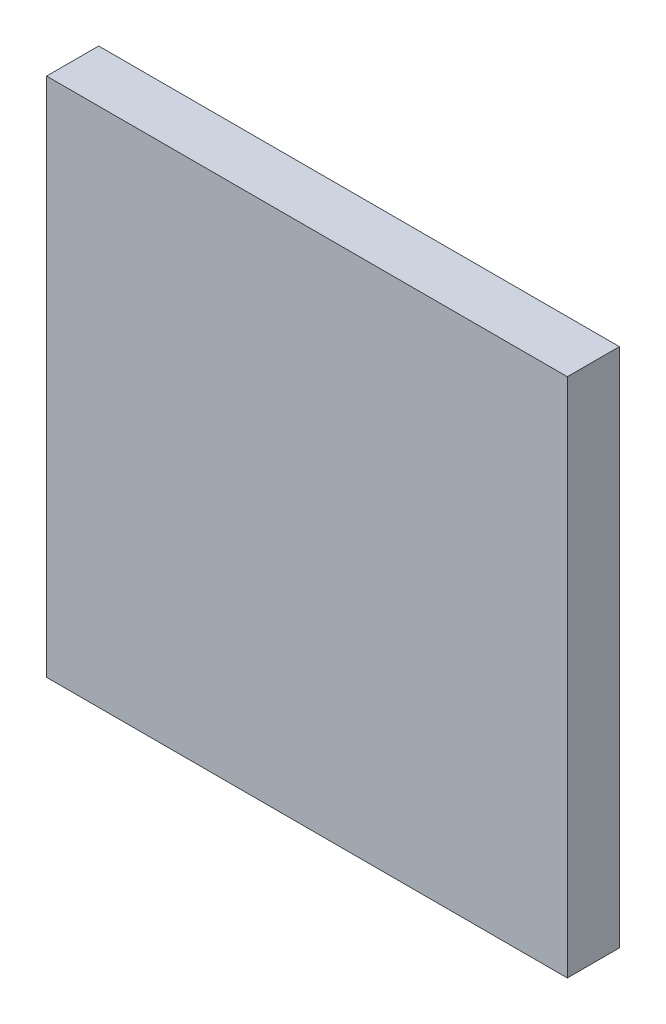
ISO-10303-21;
HEADER;
FILE_DESCRIPTION(('STEP AP214'),'2;1');
FILE_NAME('part.step','',(''),(''),'','','');
FILE_SCHEMA(('AUTOMOTIVE_DESIGN { 1 0 10303 214 1 1 1 1 }'));
ENDSEC;
DATA;
#1=APPLICATION_CONTEXT('core data for automotive mechanical design processes');
#2=APPLICATION_PROTOCOL_DEFINITION('international standard','automotive_design',2000,#1);
#3=PRODUCT_CONTEXT('',#1,'mechanical');
#4=PRODUCT('Part','Part','',(#3));
#5=PRODUCT_RELATED_PRODUCT_CATEGORY('part','',(#4));
#6=PRODUCT_DEFINITION_FORMATION('','',#4);
#7=PRODUCT_DEFINITION_CONTEXT('part definition',#1,'design');
#8=PRODUCT_DEFINITION('design','',#6,#7);
#9=PRODUCT_DEFINITION_SHAPE('','',#8);
#10=(LENGTH_UNIT() NAMED_UNIT(*) SI_UNIT(.MILLI.,.METRE.));
#11=(NAMED_UNIT(*) PLANE_ANGLE_UNIT() SI_UNIT($,.RADIAN.));
#12=(NAMED_UNIT(*) SI_UNIT($,.STERADIAN.) SOLID_ANGLE_UNIT());
#13=UNCERTAINTY_MEASURE_WITH_UNIT(LENGTH_MEASURE(1.E-05),#10,'distance_accuracy_value','');
#14=(GEOMETRIC_REPRESENTATION_CONTEXT(3) GLOBAL_UNCERTAINTY_ASSIGNED_CONTEXT((#13)) GLOBAL_UNIT_ASSIGNED_CONTEXT((#10,
#11,#12)) REPRESENTATION_CONTEXT('',''));
#15=CARTESIAN_POINT('',(0.,0.,0.));
#16=DIRECTION('',(0.,0.,1.));
#17=DIRECTION('',(1.,0.,0.));
#18=AXIS2_PLACEMENT_3D('',#15,#16,#17);
#19=CARTESIAN_POINT('',(0.,0.,30.));
#20=DIRECTION('',(1.,0.,0.));
#21=DIRECTION('',(0.,0.,-1.));
#22=AXIS2_PLACEMENT_3D('',#19,#20,#21);
#23=PLANE('',#22);
#24=DIRECTION('',(0.,-1.,0.));
#25=VECTOR('',#24,1.);
#26=CARTESIAN_POINT('',(0.,0.,0.));
#27=LINE('',#26,#25);
#28=CARTESIAN_POINT('',(0.,300.,0.));
#29=VERTEX_POINT('',#28);
#30=CARTESIAN_POINT('',(0.,0.,0.));
#31=VERTEX_POINT('',#30);
#32=EDGE_CURVE('E107',#29,#31,#27,.T.);
#33=ORIENTED_EDGE('',*,*,#32,.T.);
#34=DIRECTION('',(0.,0.,-1.));
#35=VECTOR('',#34,1.);
#36=CARTESIAN_POINT('',(0.,0.,30.));
#37=LINE('',#36,#35);
#38=CARTESIAN_POINT('',(0.,0.,30.));
#39=VERTEX_POINT('',#38);
#40=EDGE_CURVE('E11',#39,#31,#37,.T.);
#41=ORIENTED_EDGE('',*,*,#40,.F.);
#42=DIRECTION('',(0.,-1.,0.));
#43=VECTOR('',#42,1.);
#44=CARTESIAN_POINT('',(0.,0.,30.));
#45=LINE('',#44,#43);
#46=CARTESIAN_POINT('',(0.,300.,30.));
#47=VERTEX_POINT('',#46);
#48=EDGE_CURVE('E91',#47,#39,#45,.T.);
#49=ORIENTED_EDGE('',*,*,#48,.F.);
#50=DIRECTION('',(0.,0.,-1.));
#51=VECTOR('',#50,1.);
#52=CARTESIAN_POINT('',(0.,300.,30.));
#53=LINE('',#52,#51);
#54=EDGE_CURVE('E103',#47,#29,#53,.T.);
#55=ORIENTED_EDGE('',*,*,#54,.T.);
#56=EDGE_LOOP('',(#33,#41,#49,#55));
#57=FACE_BOUND('',#56,.T.);
#58=ADVANCED_FACE('F39',(#57),#23,.F.);
#59=CARTESIAN_POINT('',(0.,0.,30.));
#60=DIRECTION('',(0.,1.,0.));
#61=DIRECTION('',(0.,0.,1.));
#62=AXIS2_PLACEMENT_3D('',#59,#60,#61);
#63=PLANE('',#62);
#64=DIRECTION('',(1.,0.,0.));
#65=VECTOR('',#64,1.);
#66=CARTESIAN_POINT('',(0.,0.,0.));
#67=LINE('',#66,#65);
#68=CARTESIAN_POINT('',(300.,0.,0.));
#69=VERTEX_POINT('',#68);
#70=EDGE_CURVE('E96',#31,#69,#67,.T.);
#71=ORIENTED_EDGE('',*,*,#70,.T.);
#72=DIRECTION('',(0.,0.,-1.));
#73=VECTOR('',#72,1.);
#74=CARTESIAN_POINT('',(300.,0.,30.));
#75=LINE('',#74,#73);
#76=CARTESIAN_POINT('',(300.,0.,30.));
#77=VERTEX_POINT('',#76);
#78=EDGE_CURVE('E48',#77,#69,#75,.T.);
#79=ORIENTED_EDGE('',*,*,#78,.F.);
#80=DIRECTION('',(1.,0.,0.));
#81=VECTOR('',#80,1.);
#82=CARTESIAN_POINT('',(0.,0.,30.));
#83=LINE('',#82,#81);
#84=EDGE_CURVE('E86',#39,#77,#83,.T.);
#85=ORIENTED_EDGE('',*,*,#84,.F.);
#86=ORIENTED_EDGE('',*,*,#40,.T.);
#87=EDGE_LOOP('',(#71,#79,#85,#86));
#88=FACE_BOUND('',#87,.T.);
#89=ADVANCED_FACE('F95',(#88),#63,.F.);
#90=CARTESIAN_POINT('',(300.,0.,30.));
#91=DIRECTION('',(-1.,0.,0.));
#92=DIRECTION('',(0.,-1.,0.));
#93=AXIS2_PLACEMENT_3D('',#90,#91,#92);
#94=PLANE('',#93);
#95=DIRECTION('',(0.,1.,0.));
#96=VECTOR('',#95,1.);
#97=CARTESIAN_POINT('',(300.,0.,0.));
#98=LINE('',#97,#96);
#99=CARTESIAN_POINT('',(300.,300.,0.));
#100=VERTEX_POINT('',#99);
#101=EDGE_CURVE('E73',#69,#100,#98,.T.);
#102=ORIENTED_EDGE('',*,*,#101,.T.);
#103=DIRECTION('',(0.,0.,-1.));
#104=VECTOR('',#103,1.);
#105=CARTESIAN_POINT('',(300.,300.,30.));
#106=LINE('',#105,#104);
#107=CARTESIAN_POINT('',(300.,300.,30.));
#108=VERTEX_POINT('',#107);
#109=EDGE_CURVE('E98',#108,#100,#106,.T.);
#110=ORIENTED_EDGE('',*,*,#109,.F.);
#111=DIRECTION('',(0.,1.,0.));
#112=VECTOR('',#111,1.);
#113=CARTESIAN_POINT('',(300.,0.,30.));
#114=LINE('',#113,#112);
#115=EDGE_CURVE('E89',#77,#108,#114,.T.);
#116=ORIENTED_EDGE('',*,*,#115,.F.);
#117=ORIENTED_EDGE('',*,*,#78,.T.);
#118=EDGE_LOOP('',(#102,#110,#116,#117));
#119=FACE_BOUND('',#118,.T.);
#120=ADVANCED_FACE('F99',(#119),#94,.F.);
#121=CARTESIAN_POINT('',(0.,300.,30.));
#122=DIRECTION('',(0.,-1.,0.));
#123=DIRECTION('',(1.,0.,0.));
#124=AXIS2_PLACEMENT_3D('',#121,#122,#123);
#125=PLANE('',#124);
#126=DIRECTION('',(-1.,0.,0.));
#127=VECTOR('',#126,1.);
#128=CARTESIAN_POINT('',(0.,300.,0.));
#129=LINE('',#128,#127);
#130=EDGE_CURVE('E79',#100,#29,#129,.T.);
#131=ORIENTED_EDGE('',*,*,#130,.T.);
#132=ORIENTED_EDGE('',*,*,#54,.F.);
#133=DIRECTION('',(-1.,0.,0.));
#134=VECTOR('',#133,1.);
#135=CARTESIAN_POINT('',(0.,300.,30.));
#136=LINE('',#135,#134);
#137=EDGE_CURVE('E56',#108,#47,#136,.T.);
#138=ORIENTED_EDGE('',*,*,#137,.F.);
#139=ORIENTED_EDGE('',*,*,#109,.T.);
#140=EDGE_LOOP('',(#131,#132,#138,#139));
#141=FACE_BOUND('',#140,.T.);
#142=ADVANCED_FACE('F120',(#141),#125,.F.);
#143=CARTESIAN_POINT('',(0.,0.,30.));
#144=DIRECTION('',(0.,0.,-1.));
#145=DIRECTION('',(-1.,0.,0.));
#146=AXIS2_PLACEMENT_3D('',#143,#144,#145);
#147=PLANE('',#146);
#148=ORIENTED_EDGE('',*,*,#48,.T.);
#149=ORIENTED_EDGE('',*,*,#84,.T.);
#150=ORIENTED_EDGE('',*,*,#115,.T.);
#151=ORIENTED_EDGE('',*,*,#137,.T.);
#152=EDGE_LOOP('',(#148,#149,#150,#151));
#153=FACE_BOUND('',#152,.T.);
#154=ADVANCED_FACE('F87',(#153),#147,.F.);
#155=CARTESIAN_POINT('',(0.,0.,0.));
#156=DIRECTION('',(0.,0.,-1.));
#157=DIRECTION('',(-1.,0.,0.));
#158=AXIS2_PLACEMENT_3D('',#155,#156,#157);
#159=PLANE('',#158);
#160=ORIENTED_EDGE('',*,*,#32,.F.);
#161=ORIENTED_EDGE('',*,*,#130,.F.);
#162=ORIENTED_EDGE('',*,*,#101,.F.);
#163=ORIENTED_EDGE('',*,*,#70,.F.);
#164=EDGE_LOOP('',(#160,#161,#162,#163));
#165=FACE_BOUND('',#164,.T.);
#166=ADVANCED_FACE('F123',(#165),#159,.T.);
#167=CLOSED_SHELL('',(#58,#89,#120,#142,#154,#166));
#168=MANIFOLD_SOLID_BREP('B2',#167);
#169=ADVANCED_BREP_SHAPE_REPRESENTATION('',(#18,#168),#14);
#170=SHAPE_DEFINITION_REPRESENTATION(#9,#169);
ENDSEC;
END-ISO-10303-21;
